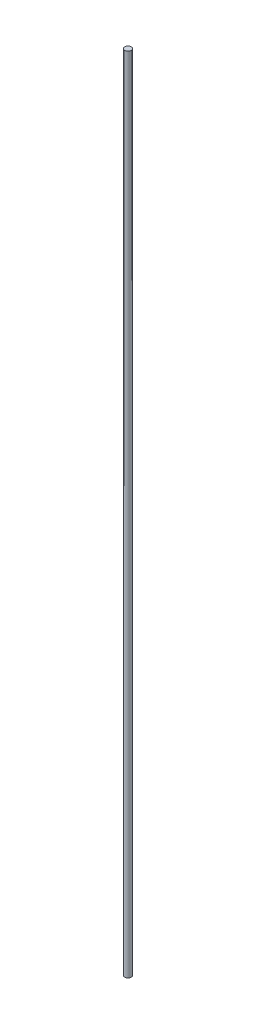
ISO-10303-21;
HEADER;
FILE_DESCRIPTION(('STEP AP214'),'2;1');
FILE_NAME('part.step','',(''),(''),'','','');
FILE_SCHEMA(('AUTOMOTIVE_DESIGN { 1 0 10303 214 1 1 1 1 }'));
ENDSEC;
DATA;
#1=APPLICATION_CONTEXT('core data for automotive mechanical design processes');
#2=APPLICATION_PROTOCOL_DEFINITION('international standard','automotive_design',2000,#1);
#3=PRODUCT_CONTEXT('',#1,'mechanical');
#4=PRODUCT('Part','Part','',(#3));
#5=PRODUCT_RELATED_PRODUCT_CATEGORY('part','',(#4));
#6=PRODUCT_DEFINITION_FORMATION('','',#4);
#7=PRODUCT_DEFINITION_CONTEXT('part definition',#1,'design');
#8=PRODUCT_DEFINITION('design','',#6,#7);
#9=PRODUCT_DEFINITION_SHAPE('','',#8);
#10=(LENGTH_UNIT() NAMED_UNIT(*) SI_UNIT(.MILLI.,.METRE.));
#11=(NAMED_UNIT(*) PLANE_ANGLE_UNIT() SI_UNIT($,.RADIAN.));
#12=(NAMED_UNIT(*) SI_UNIT($,.STERADIAN.) SOLID_ANGLE_UNIT());
#13=UNCERTAINTY_MEASURE_WITH_UNIT(LENGTH_MEASURE(1.E-05),#10,'distance_accuracy_value','');
#14=(GEOMETRIC_REPRESENTATION_CONTEXT(3) GLOBAL_UNCERTAINTY_ASSIGNED_CONTEXT((#13)) GLOBAL_UNIT_ASSIGNED_CONTEXT((#10,
#11,#12)) REPRESENTATION_CONTEXT('',''));
#15=CARTESIAN_POINT('',(0.,0.,0.));
#16=DIRECTION('',(0.,0.,1.));
#17=DIRECTION('',(1.,0.,0.));
#18=AXIS2_PLACEMENT_3D('',#15,#16,#17);
#19=CARTESIAN_POINT('',(0.,500.,0.));
#20=DIRECTION('',(0.,-1.,0.));
#21=DIRECTION('',(0.,0.,-1.));
#22=AXIS2_PLACEMENT_3D('',#19,#20,#21);
#23=CYLINDRICAL_SURFACE('',#22,2.);
#24=CARTESIAN_POINT('',(0.,500.,0.));
#25=DIRECTION('',(0.,1.,0.));
#26=DIRECTION('',(0.,0.,1.));
#27=AXIS2_PLACEMENT_3D('',#24,#25,#26);
#28=CIRCLE('',#27,2.);
#29=CARTESIAN_POINT('',(0.,500.,2.));
#30=VERTEX_POINT('',#29);
#31=EDGE_CURVE('E10',#30,#30,#28,.T.);
#32=ORIENTED_EDGE('',*,*,#31,.F.);
#33=EDGE_LOOP('',(#32));
#34=FACE_BOUND('',#33,.T.);
#35=CARTESIAN_POINT('',(0.,0.,0.));
#36=DIRECTION('',(0.,1.,0.));
#37=DIRECTION('',(0.,0.,1.));
#38=AXIS2_PLACEMENT_3D('',#35,#36,#37);
#39=CIRCLE('',#38,2.);
#40=CARTESIAN_POINT('',(0.,0.,2.));
#41=VERTEX_POINT('',#40);
#42=EDGE_CURVE('E42',#41,#41,#39,.T.);
#43=ORIENTED_EDGE('',*,*,#42,.T.);
#44=EDGE_LOOP('',(#43));
#45=FACE_BOUND('',#44,.T.);
#46=ADVANCED_FACE('F39',(#34,#45),#23,.T.);
#47=CARTESIAN_POINT('',(0.,500.,0.));
#48=DIRECTION('',(0.,1.,0.));
#49=DIRECTION('',(0.,0.,1.));
#50=AXIS2_PLACEMENT_3D('',#47,#48,#49);
#51=PLANE('',#50);
#52=ORIENTED_EDGE('',*,*,#31,.T.);
#53=EDGE_LOOP('',(#52));
#54=FACE_BOUND('',#53,.T.);
#55=ADVANCED_FACE('F54',(#54),#51,.T.);
#56=CARTESIAN_POINT('',(0.,0.,0.));
#57=DIRECTION('',(0.,1.,0.));
#58=DIRECTION('',(0.,0.,1.));
#59=AXIS2_PLACEMENT_3D('',#56,#57,#58);
#60=PLANE('',#59);
#61=ORIENTED_EDGE('',*,*,#42,.F.);
#62=EDGE_LOOP('',(#61));
#63=FACE_BOUND('',#62,.T.);
#64=ADVANCED_FACE('F52',(#63),#60,.F.);
#65=CLOSED_SHELL('',(#46,#55,#64));
#66=MANIFOLD_SOLID_BREP('B2',#65);
#67=ADVANCED_BREP_SHAPE_REPRESENTATION('',(#18,#66),#14);
#68=SHAPE_DEFINITION_REPRESENTATION(#9,#67);
ENDSEC;
END-ISO-10303-21;
